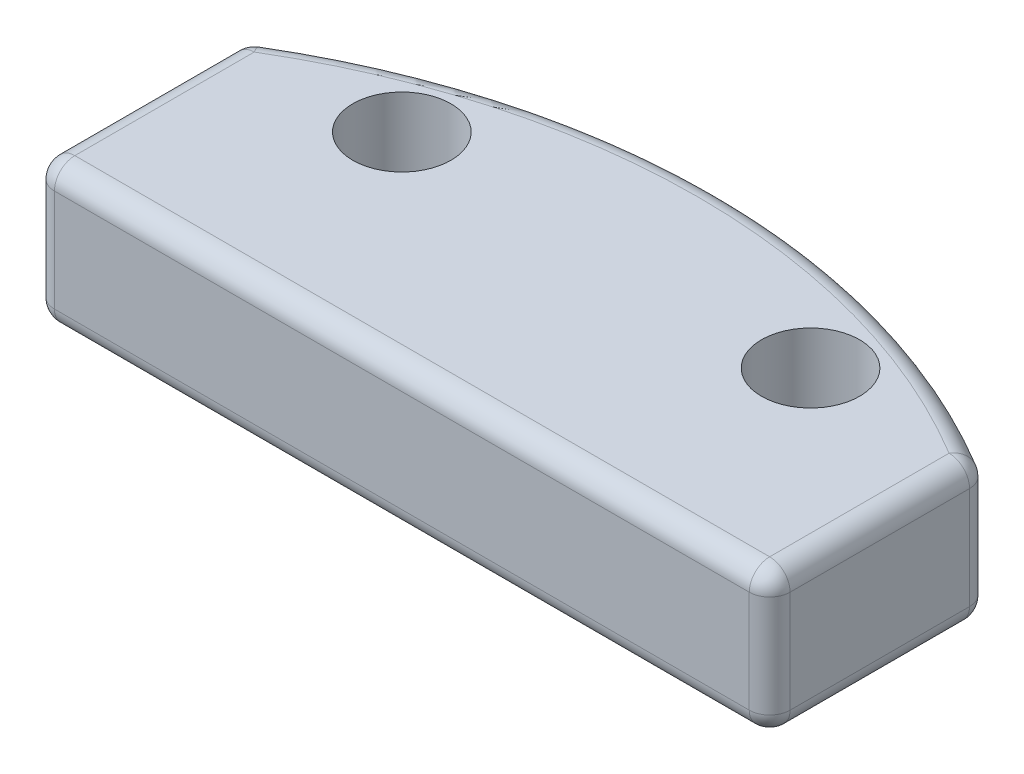
ISO-10303-21;
HEADER;
FILE_DESCRIPTION(('STEP AP214'),'2;1');
FILE_NAME('part.step','',(''),(''),'','','');
FILE_SCHEMA(('AUTOMOTIVE_DESIGN { 1 0 10303 214 1 1 1 1 }'));
ENDSEC;
DATA;
#1=APPLICATION_CONTEXT('core data for automotive mechanical design processes');
#2=APPLICATION_PROTOCOL_DEFINITION('international standard','automotive_design',2000,#1);
#3=PRODUCT_CONTEXT('',#1,'mechanical');
#4=PRODUCT('Part','Part','',(#3));
#5=PRODUCT_RELATED_PRODUCT_CATEGORY('part','',(#4));
#6=PRODUCT_DEFINITION_FORMATION('','',#4);
#7=PRODUCT_DEFINITION_CONTEXT('part definition',#1,'design');
#8=PRODUCT_DEFINITION('design','',#6,#7);
#9=PRODUCT_DEFINITION_SHAPE('','',#8);
#10=(LENGTH_UNIT() NAMED_UNIT(*) SI_UNIT(.MILLI.,.METRE.));
#11=(NAMED_UNIT(*) PLANE_ANGLE_UNIT() SI_UNIT($,.RADIAN.));
#12=(NAMED_UNIT(*) SI_UNIT($,.STERADIAN.) SOLID_ANGLE_UNIT());
#13=UNCERTAINTY_MEASURE_WITH_UNIT(LENGTH_MEASURE(1.E-05),#10,'distance_accuracy_value','');
#14=(GEOMETRIC_REPRESENTATION_CONTEXT(3) GLOBAL_UNCERTAINTY_ASSIGNED_CONTEXT((#13)) GLOBAL_UNIT_ASSIGNED_CONTEXT((#10,
#11,#12)) REPRESENTATION_CONTEXT('',''));
#15=CARTESIAN_POINT('',(0.,0.,0.));
#16=DIRECTION('',(0.,0.,1.));
#17=DIRECTION('',(1.,0.,0.));
#18=AXIS2_PLACEMENT_3D('',#15,#16,#17);
#19=CARTESIAN_POINT('',(9.,3.5,14.422205101856));
#20=DIRECTION('',(0.,-1.,0.));
#21=DIRECTION('',(0.,0.,-1.));
#22=AXIS2_PLACEMENT_3D('',#19,#20,#21);
#23=PLANE('',#22);
#24=DIRECTION('',(0.,0.,-1.));
#25=VECTOR('',#24,1.);
#26=CARTESIAN_POINT('',(17.5,3.5,14.422205101856));
#27=LINE('',#26,#25);
#28=CARTESIAN_POINT('',(17.5,3.5,4.67));
#29=VERTEX_POINT('',#28);
#30=CARTESIAN_POINT('',(17.5,3.5,0.28006947812501));
#31=VERTEX_POINT('',#30);
#32=EDGE_CURVE('E171',#29,#31,#27,.T.);
#33=ORIENTED_EDGE('',*,*,#32,.T.);
#34=CARTESIAN_POINT('',(9.,3.5,14.422205101856));
#35=DIRECTION('',(0.,-1.,0.));
#36=DIRECTION('',(0.,0.,-1.));
#37=AXIS2_PLACEMENT_3D('',#34,#35,#36);
#38=CIRCLE('',#37,16.5);
#39=CARTESIAN_POINT('',(0.5,3.5,0.280069478125011));
#40=VERTEX_POINT('',#39);
#41=EDGE_CURVE('E140',#31,#40,#38,.F.);
#42=ORIENTED_EDGE('',*,*,#41,.T.);
#43=DIRECTION('',(0.,0.,1.));
#44=VECTOR('',#43,1.);
#45=CARTESIAN_POINT('',(0.499999999999992,3.5,14.422205101856));
#46=LINE('',#45,#44);
#47=CARTESIAN_POINT('',(0.499999999999998,3.5,4.67));
#48=VERTEX_POINT('',#47);
#49=EDGE_CURVE('E159',#40,#48,#46,.T.);
#50=ORIENTED_EDGE('',*,*,#49,.T.);
#51=DIRECTION('',(1.,0.,0.));
#52=VECTOR('',#51,1.);
#53=CARTESIAN_POINT('',(9.,3.5,4.67));
#54=LINE('',#53,#52);
#55=EDGE_CURVE('E166',#48,#29,#54,.T.);
#56=ORIENTED_EDGE('',*,*,#55,.T.);
#57=EDGE_LOOP('',(#33,#42,#50,#56));
#58=FACE_BOUND('',#57,.T.);
#59=CARTESIAN_POINT('',(4.,3.5,0.17));
#60=DIRECTION('',(0.,1.,0.));
#61=DIRECTION('',(0.,0.,1.));
#62=AXIS2_PLACEMENT_3D('',#59,#60,#61);
#63=CIRCLE('',#62,1.2);
#64=CARTESIAN_POINT('',(4.,3.5,1.37));
#65=VERTEX_POINT('',#64);
#66=EDGE_CURVE('E167',#65,#65,#63,.T.);
#67=ORIENTED_EDGE('',*,*,#66,.F.);
#68=EDGE_LOOP('',(#67));
#69=FACE_BOUND('',#68,.T.);
#70=CARTESIAN_POINT('',(14.,3.5,0.17));
#71=DIRECTION('',(0.,1.,0.));
#72=DIRECTION('',(0.,0.,1.));
#73=AXIS2_PLACEMENT_3D('',#70,#71,#72);
#74=CIRCLE('',#73,1.2);
#75=CARTESIAN_POINT('',(14.,3.5,1.37));
#76=VERTEX_POINT('',#75);
#77=EDGE_CURVE('E320',#76,#76,#74,.T.);
#78=ORIENTED_EDGE('',*,*,#77,.F.);
#79=EDGE_LOOP('',(#78));
#80=FACE_BOUND('',#79,.T.);
#81=ADVANCED_FACE('F45',(#58,#69,#80),#23,.F.);
#82=CARTESIAN_POINT('',(9.,0.,14.422205101856));
#83=DIRECTION('',(0.,-1.,0.));
#84=DIRECTION('',(0.,0.,-1.));
#85=AXIS2_PLACEMENT_3D('',#82,#83,#84);
#86=PLANE('',#85);
#87=DIRECTION('',(0.,0.,1.));
#88=VECTOR('',#87,1.);
#89=CARTESIAN_POINT('',(0.5,0.,0.));
#90=LINE('',#89,#88);
#91=CARTESIAN_POINT('',(0.499999999999997,0.,4.67));
#92=VERTEX_POINT('',#91);
#93=CARTESIAN_POINT('',(0.5,0.,0.28006947812501));
#94=VERTEX_POINT('',#93);
#95=EDGE_CURVE('E190',#92,#94,#90,.F.);
#96=ORIENTED_EDGE('',*,*,#95,.T.);
#97=CARTESIAN_POINT('',(9.,0.,14.422205101856));
#98=DIRECTION('',(0.,-1.,0.));
#99=DIRECTION('',(0.,0.,-1.));
#100=AXIS2_PLACEMENT_3D('',#97,#98,#99);
#101=CIRCLE('',#100,16.5);
#102=CARTESIAN_POINT('',(17.5,0.,0.28006947812501));
#103=VERTEX_POINT('',#102);
#104=EDGE_CURVE('E199',#94,#103,#101,.T.);
#105=ORIENTED_EDGE('',*,*,#104,.T.);
#106=DIRECTION('',(0.,0.,-1.));
#107=VECTOR('',#106,1.);
#108=CARTESIAN_POINT('',(17.5,0.,5.17));
#109=LINE('',#108,#107);
#110=CARTESIAN_POINT('',(17.5,0.,4.67));
#111=VERTEX_POINT('',#110);
#112=EDGE_CURVE('E196',#103,#111,#109,.F.);
#113=ORIENTED_EDGE('',*,*,#112,.T.);
#114=DIRECTION('',(1.,0.,0.));
#115=VECTOR('',#114,1.);
#116=CARTESIAN_POINT('',(0.,0.,4.67));
#117=LINE('',#116,#115);
#118=EDGE_CURVE('E193',#111,#92,#117,.F.);
#119=ORIENTED_EDGE('',*,*,#118,.T.);
#120=EDGE_LOOP('',(#96,#105,#113,#119));
#121=FACE_BOUND('',#120,.T.);
#122=CARTESIAN_POINT('',(4.,0.,0.17));
#123=DIRECTION('',(0.,1.,0.));
#124=DIRECTION('',(0.,0.,1.));
#125=AXIS2_PLACEMENT_3D('',#122,#123,#124);
#126=CIRCLE('',#125,1.2);
#127=CARTESIAN_POINT('',(4.,0.,1.37));
#128=VERTEX_POINT('',#127);
#129=EDGE_CURVE('E326',#128,#128,#126,.T.);
#130=ORIENTED_EDGE('',*,*,#129,.T.);
#131=EDGE_LOOP('',(#130));
#132=FACE_BOUND('',#131,.T.);
#133=CARTESIAN_POINT('',(14.,0.,0.17));
#134=DIRECTION('',(0.,1.,0.));
#135=DIRECTION('',(0.,0.,1.));
#136=AXIS2_PLACEMENT_3D('',#133,#134,#135);
#137=CIRCLE('',#136,1.2);
#138=CARTESIAN_POINT('',(14.,0.,1.37));
#139=VERTEX_POINT('',#138);
#140=EDGE_CURVE('E313',#139,#139,#137,.T.);
#141=ORIENTED_EDGE('',*,*,#140,.T.);
#142=EDGE_LOOP('',(#141));
#143=FACE_BOUND('',#142,.T.);
#144=ADVANCED_FACE('F389',(#121,#132,#143),#86,.T.);
#145=CARTESIAN_POINT('',(18.,3.5,0.));
#146=DIRECTION('',(-1.,0.,0.));
#147=DIRECTION('',(0.,0.,1.));
#148=AXIS2_PLACEMENT_3D('',#145,#146,#147);
#149=PLANE('',#148);
#150=DIRECTION('',(0.,-1.,0.));
#151=VECTOR('',#150,1.);
#152=CARTESIAN_POINT('',(18.,3.5,0.280069478125009));
#153=LINE('',#152,#151);
#154=CARTESIAN_POINT('',(18.,0.5,0.280069478125009));
#155=VERTEX_POINT('',#154);
#156=CARTESIAN_POINT('',(18.,3.,0.280069478125009));
#157=VERTEX_POINT('',#156);
#158=EDGE_CURVE('E209',#155,#157,#153,.F.);
#159=ORIENTED_EDGE('',*,*,#158,.T.);
#160=DIRECTION('',(0.,0.,-1.));
#161=VECTOR('',#160,1.);
#162=CARTESIAN_POINT('',(18.,3.,0.));
#163=LINE('',#162,#161);
#164=CARTESIAN_POINT('',(18.,3.,4.67));
#165=VERTEX_POINT('',#164);
#166=EDGE_CURVE('E212',#157,#165,#163,.F.);
#167=ORIENTED_EDGE('',*,*,#166,.T.);
#168=DIRECTION('',(0.,-1.,0.));
#169=VECTOR('',#168,1.);
#170=CARTESIAN_POINT('',(18.,3.5,4.67));
#171=LINE('',#170,#169);
#172=CARTESIAN_POINT('',(18.,0.5,4.67));
#173=VERTEX_POINT('',#172);
#174=EDGE_CURVE('E203',#165,#173,#171,.T.);
#175=ORIENTED_EDGE('',*,*,#174,.T.);
#176=DIRECTION('',(0.,0.,-1.));
#177=VECTOR('',#176,1.);
#178=CARTESIAN_POINT('',(18.,0.5,0.));
#179=LINE('',#178,#177);
#180=EDGE_CURVE('E206',#173,#155,#179,.T.);
#181=ORIENTED_EDGE('',*,*,#180,.T.);
#182=EDGE_LOOP('',(#159,#167,#175,#181));
#183=FACE_BOUND('',#182,.T.);
#184=ADVANCED_FACE('F395',(#183),#149,.F.);
#185=CARTESIAN_POINT('',(9.,3.5,14.422205101856));
#186=DIRECTION('',(0.,-1.,0.));
#187=DIRECTION('',(0.,0.,-1.));
#188=AXIS2_PLACEMENT_3D('',#185,#186,#187);
#189=CYLINDRICAL_SURFACE('',#188,17.);
#190=CARTESIAN_POINT('',(9.,3.,14.422205101856));
#191=DIRECTION('',(0.,-1.,0.));
#192=DIRECTION('',(0.,0.,-1.));
#193=AXIS2_PLACEMENT_3D('',#190,#191,#192);
#194=CIRCLE('',#193,17.);
#195=CARTESIAN_POINT('',(0.242424242424243,3.,-0.148480086230474));
#196=VERTEX_POINT('',#195);
#197=CARTESIAN_POINT('',(17.7575757575758,3.,-0.148480086230474));
#198=VERTEX_POINT('',#197);
#199=EDGE_CURVE('E142',#196,#198,#194,.T.);
#200=ORIENTED_EDGE('',*,*,#199,.T.);
#201=DIRECTION('',(0.,-1.,0.));
#202=VECTOR('',#201,1.);
#203=CARTESIAN_POINT('',(17.7575757575758,3.5,-0.148480086230474));
#204=LINE('',#203,#202);
#205=CARTESIAN_POINT('',(17.7575757575758,0.5,-0.148480086230474));
#206=VERTEX_POINT('',#205);
#207=EDGE_CURVE('E187',#198,#206,#204,.T.);
#208=ORIENTED_EDGE('',*,*,#207,.T.);
#209=CARTESIAN_POINT('',(9.,0.5,14.422205101856));
#210=DIRECTION('',(0.,-1.,0.));
#211=DIRECTION('',(0.,0.,-1.));
#212=AXIS2_PLACEMENT_3D('',#209,#210,#211);
#213=CIRCLE('',#212,17.);
#214=CARTESIAN_POINT('',(0.242424242424243,0.5,-0.148480086230474));
#215=VERTEX_POINT('',#214);
#216=EDGE_CURVE('E178',#206,#215,#213,.F.);
#217=ORIENTED_EDGE('',*,*,#216,.T.);
#218=DIRECTION('',(0.,-1.,0.));
#219=VECTOR('',#218,1.);
#220=CARTESIAN_POINT('',(0.242424242424244,3.5,-0.148480086230474));
#221=LINE('',#220,#219);
#222=EDGE_CURVE('E174',#215,#196,#221,.F.);
#223=ORIENTED_EDGE('',*,*,#222,.T.);
#224=EDGE_LOOP('',(#200,#208,#217,#223));
#225=FACE_BOUND('',#224,.T.);
#226=ADVANCED_FACE('F359',(#225),#189,.T.);
#227=CARTESIAN_POINT('',(0.,3.5,0.));
#228=DIRECTION('',(1.,0.,0.));
#229=DIRECTION('',(0.,0.,-1.));
#230=AXIS2_PLACEMENT_3D('',#227,#228,#229);
#231=PLANE('',#230);
#232=DIRECTION('',(0.,0.,1.));
#233=VECTOR('',#232,1.);
#234=CARTESIAN_POINT('',(0.,3.,0.));
#235=LINE('',#234,#233);
#236=CARTESIAN_POINT('',(0.,3.,4.67));
#237=VERTEX_POINT('',#236);
#238=CARTESIAN_POINT('',(0.,3.,0.280069478125009));
#239=VERTEX_POINT('',#238);
#240=EDGE_CURVE('E55',#237,#239,#235,.F.);
#241=ORIENTED_EDGE('',*,*,#240,.T.);
#242=DIRECTION('',(0.,-1.,0.));
#243=VECTOR('',#242,1.);
#244=CARTESIAN_POINT('',(0.,3.5,0.280069478125009));
#245=LINE('',#244,#243);
#246=CARTESIAN_POINT('',(0.,0.5,0.280069478125009));
#247=VERTEX_POINT('',#246);
#248=EDGE_CURVE('E11',#239,#247,#245,.T.);
#249=ORIENTED_EDGE('',*,*,#248,.T.);
#250=DIRECTION('',(0.,0.,1.));
#251=VECTOR('',#250,1.);
#252=CARTESIAN_POINT('',(0.,0.5,5.17));
#253=LINE('',#252,#251);
#254=CARTESIAN_POINT('',(0.,0.5,4.67));
#255=VERTEX_POINT('',#254);
#256=EDGE_CURVE('E229',#247,#255,#253,.T.);
#257=ORIENTED_EDGE('',*,*,#256,.T.);
#258=DIRECTION('',(0.,-1.,0.));
#259=VECTOR('',#258,1.);
#260=CARTESIAN_POINT('',(0.,3.5,4.67));
#261=LINE('',#260,#259);
#262=EDGE_CURVE('E66',#255,#237,#261,.F.);
#263=ORIENTED_EDGE('',*,*,#262,.T.);
#264=EDGE_LOOP('',(#241,#249,#257,#263));
#265=FACE_BOUND('',#264,.T.);
#266=ADVANCED_FACE('F365',(#265),#231,.F.);
#267=CARTESIAN_POINT('',(0.,3.5,5.17));
#268=DIRECTION('',(0.,0.,-1.));
#269=DIRECTION('',(-1.,0.,0.));
#270=AXIS2_PLACEMENT_3D('',#267,#268,#269);
#271=PLANE('',#270);
#272=DIRECTION('',(0.,-1.,0.));
#273=VECTOR('',#272,1.);
#274=CARTESIAN_POINT('',(17.5,3.5,5.17));
#275=LINE('',#274,#273);
#276=CARTESIAN_POINT('',(17.5,0.5,5.17));
#277=VERTEX_POINT('',#276);
#278=CARTESIAN_POINT('',(17.5,3.,5.17));
#279=VERTEX_POINT('',#278);
#280=EDGE_CURVE('E222',#277,#279,#275,.F.);
#281=ORIENTED_EDGE('',*,*,#280,.T.);
#282=DIRECTION('',(1.,0.,0.));
#283=VECTOR('',#282,1.);
#284=CARTESIAN_POINT('',(0.,3.,5.17));
#285=LINE('',#284,#283);
#286=CARTESIAN_POINT('',(0.499999999999997,3.,5.17));
#287=VERTEX_POINT('',#286);
#288=EDGE_CURVE('E225',#279,#287,#285,.F.);
#289=ORIENTED_EDGE('',*,*,#288,.T.);
#290=DIRECTION('',(0.,-1.,0.));
#291=VECTOR('',#290,1.);
#292=CARTESIAN_POINT('',(0.499999999999997,3.5,5.17));
#293=LINE('',#292,#291);
#294=CARTESIAN_POINT('',(0.499999999999997,0.5,5.17));
#295=VERTEX_POINT('',#294);
#296=EDGE_CURVE('E216',#287,#295,#293,.T.);
#297=ORIENTED_EDGE('',*,*,#296,.T.);
#298=DIRECTION('',(1.,0.,0.));
#299=VECTOR('',#298,1.);
#300=CARTESIAN_POINT('',(18.,0.5,5.17));
#301=LINE('',#300,#299);
#302=EDGE_CURVE('E219',#295,#277,#301,.T.);
#303=ORIENTED_EDGE('',*,*,#302,.T.);
#304=EDGE_LOOP('',(#281,#289,#297,#303));
#305=FACE_BOUND('',#304,.T.);
#306=ADVANCED_FACE('F402',(#305),#271,.F.);
#307=CARTESIAN_POINT('',(4.,3.5,0.17));
#308=DIRECTION('',(0.,-1.,0.));
#309=DIRECTION('',(0.,0.,-1.));
#310=AXIS2_PLACEMENT_3D('',#307,#308,#309);
#311=CYLINDRICAL_SURFACE('',#310,1.2);
#312=ORIENTED_EDGE('',*,*,#66,.T.);
#313=EDGE_LOOP('',(#312));
#314=FACE_BOUND('',#313,.T.);
#315=ORIENTED_EDGE('',*,*,#129,.F.);
#316=EDGE_LOOP('',(#315));
#317=FACE_BOUND('',#316,.T.);
#318=ADVANCED_FACE('F399',(#314,#317),#311,.F.);
#319=CARTESIAN_POINT('',(14.,3.5,0.17));
#320=DIRECTION('',(0.,-1.,0.));
#321=DIRECTION('',(0.,0.,-1.));
#322=AXIS2_PLACEMENT_3D('',#319,#320,#321);
#323=CYLINDRICAL_SURFACE('',#322,1.2);
#324=ORIENTED_EDGE('',*,*,#77,.T.);
#325=EDGE_LOOP('',(#324));
#326=FACE_BOUND('',#325,.T.);
#327=ORIENTED_EDGE('',*,*,#140,.F.);
#328=EDGE_LOOP('',(#327));
#329=FACE_BOUND('',#328,.T.);
#330=ADVANCED_FACE('F558',(#326,#329),#323,.F.);
#331=CARTESIAN_POINT('',(0.,0.5,4.67));
#332=DIRECTION('',(-1.,0.,0.));
#333=DIRECTION('',(0.,0.,1.));
#334=AXIS2_PLACEMENT_3D('',#331,#332,#333);
#335=CYLINDRICAL_SURFACE('',#334,0.5);
#336=CARTESIAN_POINT('',(17.5,0.5,4.67));
#337=DIRECTION('',(1.,0.,0.));
#338=DIRECTION('',(0.,0.,-1.));
#339=AXIS2_PLACEMENT_3D('',#336,#337,#338);
#340=CIRCLE('',#339,0.5);
#341=EDGE_CURVE('E49',#277,#111,#340,.T.);
#342=ORIENTED_EDGE('',*,*,#341,.F.);
#343=ORIENTED_EDGE('',*,*,#302,.F.);
#344=CARTESIAN_POINT('',(0.499999999999997,0.5,4.67));
#345=DIRECTION('',(-1.,0.,0.));
#346=DIRECTION('',(0.,0.,1.));
#347=AXIS2_PLACEMENT_3D('',#344,#345,#346);
#348=CIRCLE('',#347,0.5);
#349=EDGE_CURVE('E304',#92,#295,#348,.T.);
#350=ORIENTED_EDGE('',*,*,#349,.F.);
#351=ORIENTED_EDGE('',*,*,#118,.F.);
#352=EDGE_LOOP('',(#342,#343,#350,#351));
#353=FACE_BOUND('',#352,.T.);
#354=ADVANCED_FACE('F47',(#353),#335,.T.);
#355=CARTESIAN_POINT('',(17.5,0.5,4.67));
#356=DIRECTION('',(0.,-1.,0.));
#357=DIRECTION('',(0.,0.,-1.));
#358=AXIS2_PLACEMENT_3D('',#355,#356,#357);
#359=SPHERICAL_SURFACE('',#358,0.5);
#360=CARTESIAN_POINT('',(17.5,0.5,4.67));
#361=DIRECTION('',(0.,-1.,0.));
#362=DIRECTION('',(0.,0.,-1.));
#363=AXIS2_PLACEMENT_3D('',#360,#361,#362);
#364=CIRCLE('',#363,0.5);
#365=EDGE_CURVE('E297',#277,#173,#364,.F.);
#366=ORIENTED_EDGE('',*,*,#365,.F.);
#367=ORIENTED_EDGE('',*,*,#341,.T.);
#368=CARTESIAN_POINT('',(17.5,0.5,4.67));
#369=DIRECTION('',(0.,0.,1.));
#370=DIRECTION('',(1.,0.,0.));
#371=AXIS2_PLACEMENT_3D('',#368,#369,#370);
#372=CIRCLE('',#371,0.5);
#373=EDGE_CURVE('E301',#173,#111,#372,.F.);
#374=ORIENTED_EDGE('',*,*,#373,.F.);
#375=EDGE_LOOP('',(#366,#367,#374));
#376=FACE_BOUND('',#375,.T.);
#377=ADVANCED_FACE('F544',(#376),#359,.T.);
#378=CARTESIAN_POINT('',(0.499999999999997,0.5,4.67));
#379=DIRECTION('',(0.,0.,1.));
#380=DIRECTION('',(1.,0.,0.));
#381=AXIS2_PLACEMENT_3D('',#378,#379,#380);
#382=SPHERICAL_SURFACE('',#381,0.5);
#383=CARTESIAN_POINT('',(0.499999999999997,0.5,4.67));
#384=DIRECTION('',(0.,0.,1.));
#385=DIRECTION('',(1.,0.,0.));
#386=AXIS2_PLACEMENT_3D('',#383,#384,#385);
#387=CIRCLE('',#386,0.5);
#388=EDGE_CURVE('E289',#92,#255,#387,.F.);
#389=ORIENTED_EDGE('',*,*,#388,.F.);
#390=ORIENTED_EDGE('',*,*,#349,.T.);
#391=CARTESIAN_POINT('',(0.499999999999997,0.5,4.67));
#392=DIRECTION('',(0.,-1.,0.));
#393=DIRECTION('',(0.,0.,-1.));
#394=AXIS2_PLACEMENT_3D('',#391,#392,#393);
#395=CIRCLE('',#394,0.5);
#396=EDGE_CURVE('E293',#255,#295,#395,.F.);
#397=ORIENTED_EDGE('',*,*,#396,.F.);
#398=EDGE_LOOP('',(#389,#390,#397));
#399=FACE_BOUND('',#398,.T.);
#400=ADVANCED_FACE('F371',(#399),#382,.T.);
#401=CARTESIAN_POINT('',(17.5,0.5,0.));
#402=DIRECTION('',(0.,0.,1.));
#403=DIRECTION('',(1.,0.,0.));
#404=AXIS2_PLACEMENT_3D('',#401,#402,#403);
#405=CYLINDRICAL_SURFACE('',#404,0.5);
#406=ORIENTED_EDGE('',*,*,#373,.T.);
#407=ORIENTED_EDGE('',*,*,#112,.F.);
#408=CARTESIAN_POINT('',(17.5,0.5,0.280069478125009));
#409=DIRECTION('',(0.,0.,-1.));
#410=DIRECTION('',(0.,1.,0.));
#411=AXIS2_PLACEMENT_3D('',#408,#409,#410);
#412=CIRCLE('',#411,0.5);
#413=EDGE_CURVE('E282',#155,#103,#412,.T.);
#414=ORIENTED_EDGE('',*,*,#413,.F.);
#415=ORIENTED_EDGE('',*,*,#180,.F.);
#416=EDGE_LOOP('',(#406,#407,#414,#415));
#417=FACE_BOUND('',#416,.T.);
#418=ADVANCED_FACE('F527',(#417),#405,.T.);
#419=CARTESIAN_POINT('',(17.5,3.5,4.67));
#420=DIRECTION('',(0.,-1.,0.));
#421=DIRECTION('',(0.,0.,-1.));
#422=AXIS2_PLACEMENT_3D('',#419,#420,#421);
#423=CYLINDRICAL_SURFACE('',#422,0.5);
#424=ORIENTED_EDGE('',*,*,#365,.T.);
#425=ORIENTED_EDGE('',*,*,#174,.F.);
#426=CARTESIAN_POINT('',(17.5,3.,4.67));
#427=DIRECTION('',(0.,1.,0.));
#428=DIRECTION('',(0.,0.,1.));
#429=AXIS2_PLACEMENT_3D('',#426,#427,#428);
#430=CIRCLE('',#429,0.5);
#431=EDGE_CURVE('E278',#279,#165,#430,.T.);
#432=ORIENTED_EDGE('',*,*,#431,.F.);
#433=ORIENTED_EDGE('',*,*,#280,.F.);
#434=EDGE_LOOP('',(#424,#425,#432,#433));
#435=FACE_BOUND('',#434,.T.);
#436=ADVANCED_FACE('F519',(#435),#423,.T.);
#437=CARTESIAN_POINT('',(9.,3.,4.67));
#438=DIRECTION('',(1.,0.,0.));
#439=DIRECTION('',(0.,0.,-1.));
#440=AXIS2_PLACEMENT_3D('',#437,#438,#439);
#441=CYLINDRICAL_SURFACE('',#440,0.5);
#442=CARTESIAN_POINT('',(0.499999999999997,3.,4.67));
#443=DIRECTION('',(-1.,0.,0.));
#444=DIRECTION('',(0.,-1.,0.));
#445=AXIS2_PLACEMENT_3D('',#442,#443,#444);
#446=CIRCLE('',#445,0.5);
#447=EDGE_CURVE('E270',#287,#48,#446,.T.);
#448=ORIENTED_EDGE('',*,*,#447,.F.);
#449=ORIENTED_EDGE('',*,*,#288,.F.);
#450=CARTESIAN_POINT('',(17.5,3.,4.67));
#451=DIRECTION('',(1.,0.,0.));
#452=DIRECTION('',(0.,0.,-1.));
#453=AXIS2_PLACEMENT_3D('',#450,#451,#452);
#454=CIRCLE('',#453,0.5);
#455=EDGE_CURVE('E274',#29,#279,#454,.T.);
#456=ORIENTED_EDGE('',*,*,#455,.F.);
#457=ORIENTED_EDGE('',*,*,#55,.F.);
#458=EDGE_LOOP('',(#448,#449,#456,#457));
#459=FACE_BOUND('',#458,.T.);
#460=ADVANCED_FACE('F340',(#459),#441,.T.);
#461=CARTESIAN_POINT('',(0.499999999999997,3.5,4.67));
#462=DIRECTION('',(0.,-1.,0.));
#463=DIRECTION('',(0.,0.,-1.));
#464=AXIS2_PLACEMENT_3D('',#461,#462,#463);
#465=CYLINDRICAL_SURFACE('',#464,0.5);
#466=ORIENTED_EDGE('',*,*,#396,.T.);
#467=ORIENTED_EDGE('',*,*,#296,.F.);
#468=CARTESIAN_POINT('',(0.499999999999997,3.,4.67));
#469=DIRECTION('',(0.,1.,0.));
#470=DIRECTION('',(0.,0.,1.));
#471=AXIS2_PLACEMENT_3D('',#468,#469,#470);
#472=CIRCLE('',#471,0.5);
#473=EDGE_CURVE('E267',#237,#287,#472,.T.);
#474=ORIENTED_EDGE('',*,*,#473,.F.);
#475=ORIENTED_EDGE('',*,*,#262,.F.);
#476=EDGE_LOOP('',(#466,#467,#474,#475));
#477=FACE_BOUND('',#476,.T.);
#478=ADVANCED_FACE('F374',(#477),#465,.T.);
#479=CARTESIAN_POINT('',(0.5,0.5,0.));
#480=DIRECTION('',(0.,0.,-1.));
#481=DIRECTION('',(-1.,0.,0.));
#482=AXIS2_PLACEMENT_3D('',#479,#480,#481);
#483=CYLINDRICAL_SURFACE('',#482,0.5);
#484=ORIENTED_EDGE('',*,*,#388,.T.);
#485=ORIENTED_EDGE('',*,*,#256,.F.);
#486=CARTESIAN_POINT('',(0.5,0.5,0.28006947812501));
#487=DIRECTION('',(0.,0.,-1.));
#488=DIRECTION('',(-1.,0.,0.));
#489=AXIS2_PLACEMENT_3D('',#486,#487,#488);
#490=CIRCLE('',#489,0.5);
#491=EDGE_CURVE('E263',#94,#247,#490,.T.);
#492=ORIENTED_EDGE('',*,*,#491,.F.);
#493=ORIENTED_EDGE('',*,*,#95,.F.);
#494=EDGE_LOOP('',(#484,#485,#492,#493));
#495=FACE_BOUND('',#494,.T.);
#496=ADVANCED_FACE('F370',(#495),#483,.T.);
#497=CARTESIAN_POINT('',(9.,0.5,14.422205101856));
#498=DIRECTION('',(0.,-1.,0.));
#499=DIRECTION('',(0.,0.,-1.));
#500=AXIS2_PLACEMENT_3D('',#497,#498,#499);
#501=TOROIDAL_SURFACE('',#500,16.5,0.5);
#502=CARTESIAN_POINT('',(17.5,0.5,0.28006947812501));
#503=DIRECTION('',(0.857099128710966,0.,0.515151515151517));
#504=DIRECTION('',(0.515151515151517,0.,-0.857099128710966));
#505=AXIS2_PLACEMENT_3D('',#502,#503,#504);
#506=CIRCLE('',#505,0.5);
#507=EDGE_CURVE('E285',#103,#206,#506,.T.);
#508=ORIENTED_EDGE('',*,*,#507,.F.);
#509=ORIENTED_EDGE('',*,*,#104,.F.);
#510=CARTESIAN_POINT('',(0.500000000000001,0.5,0.280069478125009));
#511=DIRECTION('',(-0.857099128710967,0.,0.515151515151515));
#512=DIRECTION('',(0.515151515151515,0.,0.857099128710967));
#513=AXIS2_PLACEMENT_3D('',#510,#511,#512);
#514=CIRCLE('',#513,0.5);
#515=EDGE_CURVE('E259',#215,#94,#514,.T.);
#516=ORIENTED_EDGE('',*,*,#515,.F.);
#517=ORIENTED_EDGE('',*,*,#216,.F.);
#518=EDGE_LOOP('',(#508,#509,#516,#517));
#519=FACE_BOUND('',#518,.T.);
#520=ADVANCED_FACE('F488',(#519),#501,.T.);
#521=CARTESIAN_POINT('',(17.5,0.5,0.280069478125009));
#522=DIRECTION('',(0.,-1.,0.));
#523=DIRECTION('',(0.,0.,-1.));
#524=AXIS2_PLACEMENT_3D('',#521,#522,#523);
#525=SPHERICAL_SURFACE('',#524,0.5);
#526=ORIENTED_EDGE('',*,*,#413,.T.);
#527=ORIENTED_EDGE('',*,*,#507,.T.);
#528=CARTESIAN_POINT('',(17.5,0.5,0.28006947812501));
#529=DIRECTION('',(0.,-1.,0.));
#530=DIRECTION('',(0.,0.,-1.));
#531=AXIS2_PLACEMENT_3D('',#528,#529,#530);
#532=CIRCLE('',#531,0.5);
#533=EDGE_CURVE('E255',#155,#206,#532,.F.);
#534=ORIENTED_EDGE('',*,*,#533,.F.);
#535=EDGE_LOOP('',(#526,#527,#534));
#536=FACE_BOUND('',#535,.T.);
#537=ADVANCED_FACE('F386',(#536),#525,.T.);
#538=CARTESIAN_POINT('',(17.5,3.,4.67));
#539=DIRECTION('',(0.,0.,1.));
#540=DIRECTION('',(1.,0.,0.));
#541=AXIS2_PLACEMENT_3D('',#538,#539,#540);
#542=SPHERICAL_SURFACE('',#541,0.5);
#543=ORIENTED_EDGE('',*,*,#455,.T.);
#544=ORIENTED_EDGE('',*,*,#431,.T.);
#545=CARTESIAN_POINT('',(17.5,3.,4.67));
#546=DIRECTION('',(0.,0.,1.));
#547=DIRECTION('',(1.,0.,0.));
#548=AXIS2_PLACEMENT_3D('',#545,#546,#547);
#549=CIRCLE('',#548,0.5);
#550=EDGE_CURVE('E252',#29,#165,#549,.F.);
#551=ORIENTED_EDGE('',*,*,#550,.F.);
#552=EDGE_LOOP('',(#543,#544,#551));
#553=FACE_BOUND('',#552,.T.);
#554=ADVANCED_FACE('F343',(#553),#542,.T.);
#555=CARTESIAN_POINT('',(0.499999999999997,3.,4.67));
#556=DIRECTION('',(0.,0.,1.));
#557=DIRECTION('',(1.,0.,0.));
#558=AXIS2_PLACEMENT_3D('',#555,#556,#557);
#559=SPHERICAL_SURFACE('',#558,0.5);
#560=ORIENTED_EDGE('',*,*,#473,.T.);
#561=ORIENTED_EDGE('',*,*,#447,.T.);
#562=CARTESIAN_POINT('',(0.499999999999998,3.,4.67));
#563=DIRECTION('',(0.,0.,1.));
#564=DIRECTION('',(1.,0.,0.));
#565=AXIS2_PLACEMENT_3D('',#562,#563,#564);
#566=CIRCLE('',#565,0.5);
#567=EDGE_CURVE('E162',#237,#48,#566,.F.);
#568=ORIENTED_EDGE('',*,*,#567,.F.);
#569=EDGE_LOOP('',(#560,#561,#568));
#570=FACE_BOUND('',#569,.T.);
#571=ADVANCED_FACE('F376',(#570),#559,.T.);
#572=CARTESIAN_POINT('',(0.5,0.5,0.28006947812501));
#573=DIRECTION('',(0.,-1.,0.));
#574=DIRECTION('',(1.,0.,0.));
#575=AXIS2_PLACEMENT_3D('',#572,#573,#574);
#576=SPHERICAL_SURFACE('',#575,0.5);
#577=ORIENTED_EDGE('',*,*,#515,.T.);
#578=ORIENTED_EDGE('',*,*,#491,.T.);
#579=CARTESIAN_POINT('',(0.5,0.5,0.280069478125009));
#580=DIRECTION('',(0.,-1.,0.));
#581=DIRECTION('',(0.,0.,-1.));
#582=AXIS2_PLACEMENT_3D('',#579,#580,#581);
#583=CIRCLE('',#582,0.5);
#584=EDGE_CURVE('E247',#215,#247,#583,.F.);
#585=ORIENTED_EDGE('',*,*,#584,.F.);
#586=EDGE_LOOP('',(#577,#578,#585));
#587=FACE_BOUND('',#586,.T.);
#588=ADVANCED_FACE('F378',(#587),#576,.T.);
#589=CARTESIAN_POINT('',(17.5,3.5,0.280069478125009));
#590=DIRECTION('',(0.,-1.,0.));
#591=DIRECTION('',(0.,0.,-1.));
#592=AXIS2_PLACEMENT_3D('',#589,#590,#591);
#593=CYLINDRICAL_SURFACE('',#592,0.5);
#594=ORIENTED_EDGE('',*,*,#533,.T.);
#595=ORIENTED_EDGE('',*,*,#207,.F.);
#596=CARTESIAN_POINT('',(17.5,3.,0.280069478125009));
#597=DIRECTION('',(0.,1.,0.));
#598=DIRECTION('',(0.,0.,1.));
#599=AXIS2_PLACEMENT_3D('',#596,#597,#598);
#600=CIRCLE('',#599,0.5);
#601=EDGE_CURVE('E243',#157,#198,#600,.T.);
#602=ORIENTED_EDGE('',*,*,#601,.F.);
#603=ORIENTED_EDGE('',*,*,#158,.F.);
#604=EDGE_LOOP('',(#594,#595,#602,#603));
#605=FACE_BOUND('',#604,.T.);
#606=ADVANCED_FACE('F355',(#605),#593,.T.);
#607=CARTESIAN_POINT('',(17.5,3.,14.422205101856));
#608=DIRECTION('',(0.,0.,-1.));
#609=DIRECTION('',(-1.,0.,0.));
#610=AXIS2_PLACEMENT_3D('',#607,#608,#609);
#611=CYLINDRICAL_SURFACE('',#610,0.5);
#612=ORIENTED_EDGE('',*,*,#550,.T.);
#613=ORIENTED_EDGE('',*,*,#166,.F.);
#614=CARTESIAN_POINT('',(17.5,3.,0.28006947812501));
#615=DIRECTION('',(0.,0.,-1.));
#616=DIRECTION('',(-1.,0.,0.));
#617=AXIS2_PLACEMENT_3D('',#614,#615,#616);
#618=CIRCLE('',#617,0.5);
#619=EDGE_CURVE('E156',#31,#157,#618,.T.);
#620=ORIENTED_EDGE('',*,*,#619,.F.);
#621=ORIENTED_EDGE('',*,*,#32,.F.);
#622=EDGE_LOOP('',(#612,#613,#620,#621));
#623=FACE_BOUND('',#622,.T.);
#624=ADVANCED_FACE('F347',(#623),#611,.T.);
#625=CARTESIAN_POINT('',(0.499999999999992,3.,14.422205101856));
#626=DIRECTION('',(0.,0.,1.));
#627=DIRECTION('',(1.,0.,0.));
#628=AXIS2_PLACEMENT_3D('',#625,#626,#627);
#629=CYLINDRICAL_SURFACE('',#628,0.5);
#630=ORIENTED_EDGE('',*,*,#567,.T.);
#631=ORIENTED_EDGE('',*,*,#49,.F.);
#632=CARTESIAN_POINT('',(0.5,3.,0.280069478125009));
#633=DIRECTION('',(0.,0.,-1.));
#634=DIRECTION('',(0.,1.,0.));
#635=AXIS2_PLACEMENT_3D('',#632,#633,#634);
#636=CIRCLE('',#635,0.5);
#637=EDGE_CURVE('E149',#239,#40,#636,.T.);
#638=ORIENTED_EDGE('',*,*,#637,.F.);
#639=ORIENTED_EDGE('',*,*,#240,.F.);
#640=EDGE_LOOP('',(#630,#631,#638,#639));
#641=FACE_BOUND('',#640,.T.);
#642=ADVANCED_FACE('F160',(#641),#629,.T.);
#643=CARTESIAN_POINT('',(0.5,3.5,0.280069478125009));
#644=DIRECTION('',(0.,-1.,0.));
#645=DIRECTION('',(0.,0.,-1.));
#646=AXIS2_PLACEMENT_3D('',#643,#644,#645);
#647=CYLINDRICAL_SURFACE('',#646,0.5);
#648=ORIENTED_EDGE('',*,*,#584,.T.);
#649=ORIENTED_EDGE('',*,*,#248,.F.);
#650=CARTESIAN_POINT('',(0.500000000000001,3.,0.280069478125009));
#651=DIRECTION('',(0.,1.,0.));
#652=DIRECTION('',(0.,0.,1.));
#653=AXIS2_PLACEMENT_3D('',#650,#651,#652);
#654=CIRCLE('',#653,0.5);
#655=EDGE_CURVE('E153',#196,#239,#654,.T.);
#656=ORIENTED_EDGE('',*,*,#655,.F.);
#657=ORIENTED_EDGE('',*,*,#222,.F.);
#658=EDGE_LOOP('',(#648,#649,#656,#657));
#659=FACE_BOUND('',#658,.T.);
#660=ADVANCED_FACE('F363',(#659),#647,.T.);
#661=CARTESIAN_POINT('',(17.5,3.,0.280069478125009));
#662=DIRECTION('',(0.,1.,0.));
#663=DIRECTION('',(0.,0.,1.));
#664=AXIS2_PLACEMENT_3D('',#661,#662,#663);
#665=SPHERICAL_SURFACE('',#664,0.5);
#666=ORIENTED_EDGE('',*,*,#619,.T.);
#667=ORIENTED_EDGE('',*,*,#601,.T.);
#668=CARTESIAN_POINT('',(17.5,3.,0.28006947812501));
#669=DIRECTION('',(0.857099128710966,0.,0.515151515151517));
#670=DIRECTION('',(0.515151515151517,0.,-0.857099128710966));
#671=AXIS2_PLACEMENT_3D('',#668,#669,#670);
#672=CIRCLE('',#671,0.5);
#673=EDGE_CURVE('E146',#31,#198,#672,.F.);
#674=ORIENTED_EDGE('',*,*,#673,.F.);
#675=EDGE_LOOP('',(#666,#667,#674));
#676=FACE_BOUND('',#675,.T.);
#677=ADVANCED_FACE('F351',(#676),#665,.T.);
#678=CARTESIAN_POINT('',(0.5,3.,0.28006947812501));
#679=DIRECTION('',(0.,1.,0.));
#680=DIRECTION('',(0.,0.,1.));
#681=AXIS2_PLACEMENT_3D('',#678,#679,#680);
#682=SPHERICAL_SURFACE('',#681,0.5);
#683=ORIENTED_EDGE('',*,*,#655,.T.);
#684=ORIENTED_EDGE('',*,*,#637,.T.);
#685=CARTESIAN_POINT('',(0.5,3.,0.280069478125011));
#686=DIRECTION('',(-0.857099128710968,0.,0.515151515151513));
#687=DIRECTION('',(0.515151515151513,0.,0.857099128710968));
#688=AXIS2_PLACEMENT_3D('',#685,#686,#687);
#689=CIRCLE('',#688,0.5);
#690=EDGE_CURVE('E136',#196,#40,#689,.F.);
#691=ORIENTED_EDGE('',*,*,#690,.F.);
#692=EDGE_LOOP('',(#683,#684,#691));
#693=FACE_BOUND('',#692,.T.);
#694=ADVANCED_FACE('F151',(#693),#682,.T.);
#695=CARTESIAN_POINT('',(9.,3.,14.422205101856));
#696=DIRECTION('',(0.,-1.,0.));
#697=DIRECTION('',(0.,0.,-1.));
#698=AXIS2_PLACEMENT_3D('',#695,#696,#697);
#699=TOROIDAL_SURFACE('',#698,16.5,0.5);
#700=ORIENTED_EDGE('',*,*,#673,.T.);
#701=ORIENTED_EDGE('',*,*,#199,.F.);
#702=ORIENTED_EDGE('',*,*,#690,.T.);
#703=ORIENTED_EDGE('',*,*,#41,.F.);
#704=EDGE_LOOP('',(#700,#701,#702,#703));
#705=FACE_BOUND('',#704,.T.);
#706=ADVANCED_FACE('F138',(#705),#699,.T.);
#707=CLOSED_SHELL('',(#81,#144,#184,#226,#266,#306,#318,#330,#354,#377,#400,#418,#436,#460,#478,
#496,#520,#537,#554,#571,#588,#606,#624,#642,#660,#677,#694,#706));
#708=MANIFOLD_SOLID_BREP('B2',#707);
#709=ADVANCED_BREP_SHAPE_REPRESENTATION('',(#18,#708),#14);
#710=SHAPE_DEFINITION_REPRESENTATION(#9,#709);
ENDSEC;
END-ISO-10303-21;
